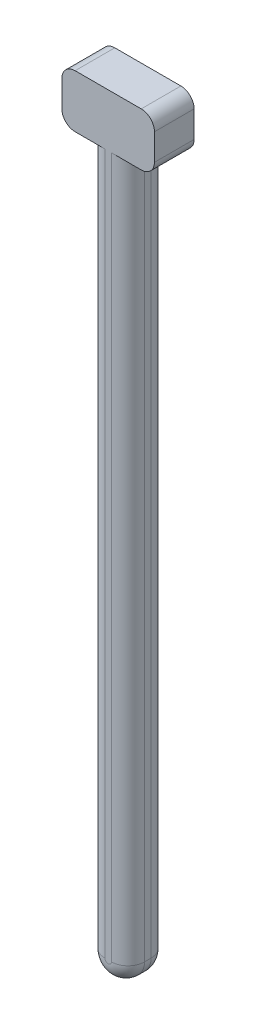
ISO-10303-21;
HEADER;
FILE_DESCRIPTION(('STEP AP214'),'2;1');
FILE_NAME('part.step','',(''),(''),'','','');
FILE_SCHEMA(('AUTOMOTIVE_DESIGN { 1 0 10303 214 1 1 1 1 }'));
ENDSEC;
DATA;
#1=APPLICATION_CONTEXT('core data for automotive mechanical design processes');
#2=APPLICATION_PROTOCOL_DEFINITION('international standard','automotive_design',2000,#1);
#3=PRODUCT_CONTEXT('',#1,'mechanical');
#4=PRODUCT('Part','Part','',(#3));
#5=PRODUCT_RELATED_PRODUCT_CATEGORY('part','',(#4));
#6=PRODUCT_DEFINITION_FORMATION('','',#4);
#7=PRODUCT_DEFINITION_CONTEXT('part definition',#1,'design');
#8=PRODUCT_DEFINITION('design','',#6,#7);
#9=PRODUCT_DEFINITION_SHAPE('','',#8);
#10=(LENGTH_UNIT() NAMED_UNIT(*) SI_UNIT(.MILLI.,.METRE.));
#11=(NAMED_UNIT(*) PLANE_ANGLE_UNIT() SI_UNIT($,.RADIAN.));
#12=(NAMED_UNIT(*) SI_UNIT($,.STERADIAN.) SOLID_ANGLE_UNIT());
#13=UNCERTAINTY_MEASURE_WITH_UNIT(LENGTH_MEASURE(1.E-05),#10,'distance_accuracy_value','');
#14=(GEOMETRIC_REPRESENTATION_CONTEXT(3) GLOBAL_UNCERTAINTY_ASSIGNED_CONTEXT((#13)) GLOBAL_UNIT_ASSIGNED_CONTEXT((#10,
#11,#12)) REPRESENTATION_CONTEXT('',''));
#15=CARTESIAN_POINT('',(0.,0.,0.));
#16=DIRECTION('',(0.,0.,1.));
#17=DIRECTION('',(1.,0.,0.));
#18=AXIS2_PLACEMENT_3D('',#15,#16,#17);
#19=CARTESIAN_POINT('',(0.,-2.,3.));
#20=DIRECTION('',(0.,1.,0.));
#21=DIRECTION('',(0.,0.,1.));
#22=AXIS2_PLACEMENT_3D('',#19,#20,#21);
#23=PLANE('',#22);
#24=DIRECTION('',(1.,0.,0.));
#25=VECTOR('',#24,1.);
#26=CARTESIAN_POINT('',(0.,-2.,3.));
#27=LINE('',#26,#25);
#28=CARTESIAN_POINT('',(-2.5,-2.,3.));
#29=VERTEX_POINT('',#28);
#30=CARTESIAN_POINT('',(-0.250000000000001,-2.,3.));
#31=VERTEX_POINT('',#30);
#32=EDGE_CURVE('E242',#29,#31,#27,.T.);
#33=ORIENTED_EDGE('',*,*,#32,.F.);
#34=DIRECTION('',(0.,0.,-1.));
#35=VECTOR('',#34,1.);
#36=CARTESIAN_POINT('',(-2.5,-2.,0.));
#37=LINE('',#36,#35);
#38=CARTESIAN_POINT('',(-2.5,-2.,0.));
#39=VERTEX_POINT('',#38);
#40=EDGE_CURVE('E194',#29,#39,#37,.T.);
#41=ORIENTED_EDGE('',*,*,#40,.T.);
#42=DIRECTION('',(1.,0.,0.));
#43=VECTOR('',#42,1.);
#44=CARTESIAN_POINT('',(0.,-2.,0.));
#45=LINE('',#44,#43);
#46=CARTESIAN_POINT('',(-0.250000000000001,-2.,0.));
#47=VERTEX_POINT('',#46);
#48=EDGE_CURVE('E260',#39,#47,#45,.T.);
#49=ORIENTED_EDGE('',*,*,#48,.T.);
#50=CARTESIAN_POINT('',(-0.250000000000001,-2.,1.25));
#51=DIRECTION('',(0.,1.,0.));
#52=DIRECTION('',(0.,0.,1.));
#53=AXIS2_PLACEMENT_3D('',#50,#51,#52);
#54=CIRCLE('',#53,1.25);
#55=CARTESIAN_POINT('',(-1.5,-2.,1.25));
#56=VERTEX_POINT('',#55);
#57=EDGE_CURVE('E288',#47,#56,#54,.T.);
#58=ORIENTED_EDGE('',*,*,#57,.T.);
#59=DIRECTION('',(0.,0.,-1.));
#60=VECTOR('',#59,1.);
#61=CARTESIAN_POINT('',(-1.5,-2.,3.));
#62=LINE('',#61,#60);
#63=CARTESIAN_POINT('',(-1.5,-2.,1.75));
#64=VERTEX_POINT('',#63);
#65=EDGE_CURVE('E172',#64,#56,#62,.T.);
#66=ORIENTED_EDGE('',*,*,#65,.F.);
#67=CARTESIAN_POINT('',(-0.250000000000001,-2.,1.75));
#68=DIRECTION('',(0.,1.,0.));
#69=DIRECTION('',(0.,0.,1.));
#70=AXIS2_PLACEMENT_3D('',#67,#68,#69);
#71=CIRCLE('',#70,1.25);
#72=EDGE_CURVE('E181',#64,#31,#71,.T.);
#73=ORIENTED_EDGE('',*,*,#72,.T.);
#74=EDGE_LOOP('',(#33,#41,#49,#58,#66,#73));
#75=FACE_BOUND('',#74,.T.);
#76=ADVANCED_FACE('F35',(#75),#23,.F.);
#77=CARTESIAN_POINT('',(-1.5,0.,3.));
#78=DIRECTION('',(1.,0.,0.));
#79=DIRECTION('',(0.,1.,0.));
#80=AXIS2_PLACEMENT_3D('',#77,#78,#79);
#81=PLANE('',#80);
#82=ORIENTED_EDGE('',*,*,#65,.T.);
#83=DIRECTION('',(0.,-1.,0.));
#84=VECTOR('',#83,1.);
#85=CARTESIAN_POINT('',(-1.5,0.,1.25));
#86=LINE('',#85,#84);
#87=CARTESIAN_POINT('',(-1.49999999999999,-55.,1.25));
#88=VERTEX_POINT('',#87);
#89=EDGE_CURVE('E171',#56,#88,#86,.T.);
#90=ORIENTED_EDGE('',*,*,#89,.T.);
#91=DIRECTION('',(0.,0.,-1.));
#92=VECTOR('',#91,1.);
#93=CARTESIAN_POINT('',(-1.49999999999999,-55.,3.));
#94=LINE('',#93,#92);
#95=CARTESIAN_POINT('',(-1.49999999999999,-55.,1.75));
#96=VERTEX_POINT('',#95);
#97=EDGE_CURVE('E153',#96,#88,#94,.T.);
#98=ORIENTED_EDGE('',*,*,#97,.F.);
#99=DIRECTION('',(0.,-1.,0.));
#100=VECTOR('',#99,1.);
#101=CARTESIAN_POINT('',(-1.5,-2.,1.75));
#102=LINE('',#101,#100);
#103=EDGE_CURVE('E168',#96,#64,#102,.F.);
#104=ORIENTED_EDGE('',*,*,#103,.T.);
#105=EDGE_LOOP('',(#82,#90,#98,#104));
#106=FACE_BOUND('',#105,.T.);
#107=ADVANCED_FACE('F167',(#106),#81,.F.);
#108=CARTESIAN_POINT('',(0.,-55.,3.));
#109=DIRECTION('',(0.,0.,-1.));
#110=DIRECTION('',(-1.,0.,0.));
#111=AXIS2_PLACEMENT_3D('',#108,#109,#110);
#112=CYLINDRICAL_SURFACE('',#111,1.5);
#113=ORIENTED_EDGE('',*,*,#97,.T.);
#114=CARTESIAN_POINT('',(0.,-55.,1.25));
#115=DIRECTION('',(0.,0.,1.));
#116=DIRECTION('',(1.,0.,0.));
#117=AXIS2_PLACEMENT_3D('',#114,#115,#116);
#118=CIRCLE('',#117,1.5);
#119=CARTESIAN_POINT('',(1.50000000000001,-55.,1.25));
#120=VERTEX_POINT('',#119);
#121=EDGE_CURVE('E160',#88,#120,#118,.T.);
#122=ORIENTED_EDGE('',*,*,#121,.T.);
#123=DIRECTION('',(0.,0.,-1.));
#124=VECTOR('',#123,1.);
#125=CARTESIAN_POINT('',(1.50000000000001,-55.,3.));
#126=LINE('',#125,#124);
#127=CARTESIAN_POINT('',(1.50000000000001,-55.,1.75));
#128=VERTEX_POINT('',#127);
#129=EDGE_CURVE('E155',#128,#120,#126,.T.);
#130=ORIENTED_EDGE('',*,*,#129,.F.);
#131=CARTESIAN_POINT('',(0.,-55.,1.75));
#132=DIRECTION('',(0.,0.,1.));
#133=DIRECTION('',(1.,0.,0.));
#134=AXIS2_PLACEMENT_3D('',#131,#132,#133);
#135=CIRCLE('',#134,1.5);
#136=EDGE_CURVE('E150',#128,#96,#135,.F.);
#137=ORIENTED_EDGE('',*,*,#136,.T.);
#138=EDGE_LOOP('',(#113,#122,#130,#137));
#139=FACE_BOUND('',#138,.T.);
#140=ADVANCED_FACE('F152',(#139),#112,.T.);
#141=CARTESIAN_POINT('',(1.5,0.,3.));
#142=DIRECTION('',(1.,0.,0.));
#143=DIRECTION('',(0.,1.,0.));
#144=AXIS2_PLACEMENT_3D('',#141,#142,#143);
#145=PLANE('',#144);
#146=ORIENTED_EDGE('',*,*,#129,.T.);
#147=DIRECTION('',(0.,-1.,0.));
#148=VECTOR('',#147,1.);
#149=CARTESIAN_POINT('',(1.5,-2.,1.25));
#150=LINE('',#149,#148);
#151=CARTESIAN_POINT('',(1.5,-2.,1.25));
#152=VERTEX_POINT('',#151);
#153=EDGE_CURVE('E286',#120,#152,#150,.F.);
#154=ORIENTED_EDGE('',*,*,#153,.T.);
#155=DIRECTION('',(0.,0.,-1.));
#156=VECTOR('',#155,1.);
#157=CARTESIAN_POINT('',(1.5,-2.,3.));
#158=LINE('',#157,#156);
#159=CARTESIAN_POINT('',(1.5,-2.,1.75));
#160=VERTEX_POINT('',#159);
#161=EDGE_CURVE('E266',#160,#152,#158,.T.);
#162=ORIENTED_EDGE('',*,*,#161,.F.);
#163=DIRECTION('',(0.,-1.,0.));
#164=VECTOR('',#163,1.);
#165=CARTESIAN_POINT('',(1.5,0.,1.75));
#166=LINE('',#165,#164);
#167=EDGE_CURVE('E284',#160,#128,#166,.T.);
#168=ORIENTED_EDGE('',*,*,#167,.T.);
#169=EDGE_LOOP('',(#146,#154,#162,#168));
#170=FACE_BOUND('',#169,.T.);
#171=ADVANCED_FACE('F327',(#170),#145,.T.);
#172=CARTESIAN_POINT('',(0.249999999999999,-2.,0.));
#173=VERTEX_POINT('',#172);
#174=CARTESIAN_POINT('',(2.5,-2.,0.));
#175=VERTEX_POINT('',#174);
#176=EDGE_CURVE('E232',#173,#175,#45,.T.);
#177=ORIENTED_EDGE('',*,*,#176,.T.);
#178=DIRECTION('',(0.,0.,-1.));
#179=VECTOR('',#178,1.);
#180=CARTESIAN_POINT('',(2.5,-2.,3.));
#181=LINE('',#180,#179);
#182=CARTESIAN_POINT('',(2.5,-2.,3.));
#183=VERTEX_POINT('',#182);
#184=EDGE_CURVE('E223',#175,#183,#181,.F.);
#185=ORIENTED_EDGE('',*,*,#184,.T.);
#186=CARTESIAN_POINT('',(0.249999999999999,-2.,3.));
#187=VERTEX_POINT('',#186);
#188=EDGE_CURVE('E229',#187,#183,#27,.T.);
#189=ORIENTED_EDGE('',*,*,#188,.F.);
#190=CARTESIAN_POINT('',(0.249999999999999,-2.,1.75));
#191=DIRECTION('',(0.,1.,0.));
#192=DIRECTION('',(0.,0.,1.));
#193=AXIS2_PLACEMENT_3D('',#190,#191,#192);
#194=CIRCLE('',#193,1.25);
#195=EDGE_CURVE('E198',#187,#160,#194,.T.);
#196=ORIENTED_EDGE('',*,*,#195,.T.);
#197=ORIENTED_EDGE('',*,*,#161,.T.);
#198=CARTESIAN_POINT('',(0.249999999999999,-2.,1.25));
#199=DIRECTION('',(0.,1.,0.));
#200=DIRECTION('',(0.,0.,1.));
#201=AXIS2_PLACEMENT_3D('',#198,#199,#200);
#202=CIRCLE('',#201,1.25);
#203=EDGE_CURVE('E291',#152,#173,#202,.T.);
#204=ORIENTED_EDGE('',*,*,#203,.T.);
#205=EDGE_LOOP('',(#177,#185,#189,#196,#197,#204));
#206=FACE_BOUND('',#205,.T.);
#207=ADVANCED_FACE('F228',(#206),#23,.F.);
#208=CARTESIAN_POINT('',(3.5,0.,3.));
#209=DIRECTION('',(-1.,0.,0.));
#210=DIRECTION('',(0.,0.,1.));
#211=AXIS2_PLACEMENT_3D('',#208,#209,#210);
#212=PLANE('',#211);
#213=DIRECTION('',(0.,1.,0.));
#214=VECTOR('',#213,1.);
#215=CARTESIAN_POINT('',(3.5,0.,3.));
#216=LINE('',#215,#214);
#217=CARTESIAN_POINT('',(3.5,-1.,3.));
#218=VERTEX_POINT('',#217);
#219=CARTESIAN_POINT('',(3.5,1.,3.));
#220=VERTEX_POINT('',#219);
#221=EDGE_CURVE('E241',#218,#220,#216,.T.);
#222=ORIENTED_EDGE('',*,*,#221,.F.);
#223=DIRECTION('',(0.,0.,-1.));
#224=VECTOR('',#223,1.);
#225=CARTESIAN_POINT('',(3.5,-1.,3.));
#226=LINE('',#225,#224);
#227=CARTESIAN_POINT('',(3.5,-1.,0.));
#228=VERTEX_POINT('',#227);
#229=EDGE_CURVE('E220',#218,#228,#226,.T.);
#230=ORIENTED_EDGE('',*,*,#229,.T.);
#231=DIRECTION('',(0.,1.,0.));
#232=VECTOR('',#231,1.);
#233=CARTESIAN_POINT('',(3.5,0.,0.));
#234=LINE('',#233,#232);
#235=CARTESIAN_POINT('',(3.5,1.,0.));
#236=VERTEX_POINT('',#235);
#237=EDGE_CURVE('E250',#228,#236,#234,.T.);
#238=ORIENTED_EDGE('',*,*,#237,.T.);
#239=DIRECTION('',(0.,0.,-1.));
#240=VECTOR('',#239,1.);
#241=CARTESIAN_POINT('',(3.5,1.,3.));
#242=LINE('',#241,#240);
#243=EDGE_CURVE('E218',#236,#220,#242,.F.);
#244=ORIENTED_EDGE('',*,*,#243,.T.);
#245=EDGE_LOOP('',(#222,#230,#238,#244));
#246=FACE_BOUND('',#245,.T.);
#247=ADVANCED_FACE('F249',(#246),#212,.F.);
#248=CARTESIAN_POINT('',(0.,2.,3.));
#249=DIRECTION('',(0.,1.,0.));
#250=DIRECTION('',(0.,0.,1.));
#251=AXIS2_PLACEMENT_3D('',#248,#249,#250);
#252=PLANE('',#251);
#253=DIRECTION('',(1.,0.,0.));
#254=VECTOR('',#253,1.);
#255=CARTESIAN_POINT('',(0.,2.,3.));
#256=LINE('',#255,#254);
#257=CARTESIAN_POINT('',(-2.5,2.,3.));
#258=VERTEX_POINT('',#257);
#259=CARTESIAN_POINT('',(2.5,2.,3.));
#260=VERTEX_POINT('',#259);
#261=EDGE_CURVE('E368',#258,#260,#256,.T.);
#262=ORIENTED_EDGE('',*,*,#261,.T.);
#263=DIRECTION('',(0.,0.,-1.));
#264=VECTOR('',#263,1.);
#265=CARTESIAN_POINT('',(2.5,2.,0.));
#266=LINE('',#265,#264);
#267=CARTESIAN_POINT('',(2.5,2.,0.));
#268=VERTEX_POINT('',#267);
#269=EDGE_CURVE('E11',#260,#268,#266,.T.);
#270=ORIENTED_EDGE('',*,*,#269,.T.);
#271=DIRECTION('',(1.,0.,0.));
#272=VECTOR('',#271,1.);
#273=CARTESIAN_POINT('',(0.,2.,0.));
#274=LINE('',#273,#272);
#275=CARTESIAN_POINT('',(-2.5,2.,0.));
#276=VERTEX_POINT('',#275);
#277=EDGE_CURVE('E256',#276,#268,#274,.T.);
#278=ORIENTED_EDGE('',*,*,#277,.F.);
#279=DIRECTION('',(0.,0.,-1.));
#280=VECTOR('',#279,1.);
#281=CARTESIAN_POINT('',(-2.5,2.,3.));
#282=LINE('',#281,#280);
#283=EDGE_CURVE('E43',#276,#258,#282,.F.);
#284=ORIENTED_EDGE('',*,*,#283,.T.);
#285=EDGE_LOOP('',(#262,#270,#278,#284));
#286=FACE_BOUND('',#285,.T.);
#287=ADVANCED_FACE('F332',(#286),#252,.T.);
#288=CARTESIAN_POINT('',(-3.5,0.,3.));
#289=DIRECTION('',(-1.,0.,0.));
#290=DIRECTION('',(0.,0.,1.));
#291=AXIS2_PLACEMENT_3D('',#288,#289,#290);
#292=PLANE('',#291);
#293=DIRECTION('',(0.,1.,0.));
#294=VECTOR('',#293,1.);
#295=CARTESIAN_POINT('',(-3.5,0.,0.));
#296=LINE('',#295,#294);
#297=CARTESIAN_POINT('',(-3.5,-1.,0.));
#298=VERTEX_POINT('',#297);
#299=CARTESIAN_POINT('',(-3.5,1.,0.));
#300=VERTEX_POINT('',#299);
#301=EDGE_CURVE('E258',#298,#300,#296,.T.);
#302=ORIENTED_EDGE('',*,*,#301,.F.);
#303=DIRECTION('',(0.,0.,-1.));
#304=VECTOR('',#303,1.);
#305=CARTESIAN_POINT('',(-3.5,-1.,3.));
#306=LINE('',#305,#304);
#307=CARTESIAN_POINT('',(-3.5,-1.,3.));
#308=VERTEX_POINT('',#307);
#309=EDGE_CURVE('E209',#298,#308,#306,.F.);
#310=ORIENTED_EDGE('',*,*,#309,.T.);
#311=DIRECTION('',(0.,1.,0.));
#312=VECTOR('',#311,1.);
#313=CARTESIAN_POINT('',(-3.5,0.,3.));
#314=LINE('',#313,#312);
#315=CARTESIAN_POINT('',(-3.5,1.,3.));
#316=VERTEX_POINT('',#315);
#317=EDGE_CURVE('E269',#308,#316,#314,.T.);
#318=ORIENTED_EDGE('',*,*,#317,.T.);
#319=DIRECTION('',(0.,0.,-1.));
#320=VECTOR('',#319,1.);
#321=CARTESIAN_POINT('',(-3.5,1.,3.));
#322=LINE('',#321,#320);
#323=EDGE_CURVE('E206',#316,#300,#322,.T.);
#324=ORIENTED_EDGE('',*,*,#323,.T.);
#325=EDGE_LOOP('',(#302,#310,#318,#324));
#326=FACE_BOUND('',#325,.T.);
#327=ADVANCED_FACE('F374',(#326),#292,.T.);
#328=CARTESIAN_POINT('',(0.,0.,3.));
#329=DIRECTION('',(0.,0.,1.));
#330=DIRECTION('',(1.,0.,0.));
#331=AXIS2_PLACEMENT_3D('',#328,#329,#330);
#332=PLANE('',#331);
#333=ORIENTED_EDGE('',*,*,#317,.F.);
#334=CARTESIAN_POINT('',(-2.5,-1.,3.));
#335=DIRECTION('',(0.,0.,1.));
#336=DIRECTION('',(1.,0.,0.));
#337=AXIS2_PLACEMENT_3D('',#334,#335,#336);
#338=CIRCLE('',#337,1.);
#339=EDGE_CURVE('E216',#308,#29,#338,.T.);
#340=ORIENTED_EDGE('',*,*,#339,.T.);
#341=ORIENTED_EDGE('',*,*,#32,.T.);
#342=DIRECTION('',(0.,-1.,0.));
#343=VECTOR('',#342,1.);
#344=CARTESIAN_POINT('',(-0.249999999999995,-55.,3.));
#345=LINE('',#344,#343);
#346=CARTESIAN_POINT('',(-0.249999999999995,-55.,3.));
#347=VERTEX_POINT('',#346);
#348=EDGE_CURVE('E282',#31,#347,#345,.T.);
#349=ORIENTED_EDGE('',*,*,#348,.T.);
#350=CARTESIAN_POINT('',(0.,-55.,3.));
#351=DIRECTION('',(0.,0.,1.));
#352=DIRECTION('',(1.,0.,0.));
#353=AXIS2_PLACEMENT_3D('',#350,#351,#352);
#354=CIRCLE('',#353,0.25);
#355=CARTESIAN_POINT('',(0.250000000000005,-55.,3.));
#356=VERTEX_POINT('',#355);
#357=EDGE_CURVE('E184',#347,#356,#354,.T.);
#358=ORIENTED_EDGE('',*,*,#357,.T.);
#359=DIRECTION('',(0.,-1.,0.));
#360=VECTOR('',#359,1.);
#361=CARTESIAN_POINT('',(0.249999999999999,0.,3.));
#362=LINE('',#361,#360);
#363=EDGE_CURVE('E239',#356,#187,#362,.F.);
#364=ORIENTED_EDGE('',*,*,#363,.T.);
#365=ORIENTED_EDGE('',*,*,#188,.T.);
#366=CARTESIAN_POINT('',(2.5,-1.,3.));
#367=DIRECTION('',(0.,0.,1.));
#368=DIRECTION('',(1.,0.,0.));
#369=AXIS2_PLACEMENT_3D('',#366,#367,#368);
#370=CIRCLE('',#369,1.);
#371=EDGE_CURVE('E214',#183,#218,#370,.T.);
#372=ORIENTED_EDGE('',*,*,#371,.T.);
#373=ORIENTED_EDGE('',*,*,#221,.T.);
#374=CARTESIAN_POINT('',(2.5,1.,3.));
#375=DIRECTION('',(0.,0.,1.));
#376=DIRECTION('',(1.,0.,0.));
#377=AXIS2_PLACEMENT_3D('',#374,#375,#376);
#378=CIRCLE('',#377,1.);
#379=EDGE_CURVE('E50',#220,#260,#378,.T.);
#380=ORIENTED_EDGE('',*,*,#379,.T.);
#381=ORIENTED_EDGE('',*,*,#261,.F.);
#382=CARTESIAN_POINT('',(-2.5,1.,3.));
#383=DIRECTION('',(0.,0.,1.));
#384=DIRECTION('',(1.,0.,0.));
#385=AXIS2_PLACEMENT_3D('',#382,#383,#384);
#386=CIRCLE('',#385,1.);
#387=EDGE_CURVE('E211',#258,#316,#386,.T.);
#388=ORIENTED_EDGE('',*,*,#387,.T.);
#389=EDGE_LOOP('',(#333,#340,#341,#349,#358,#364,#365,#372,#373,#380,#381,#388));
#390=FACE_BOUND('',#389,.T.);
#391=ADVANCED_FACE('F236',(#390),#332,.T.);
#392=CARTESIAN_POINT('',(0.,0.,0.));
#393=DIRECTION('',(0.,0.,1.));
#394=DIRECTION('',(1.,0.,0.));
#395=AXIS2_PLACEMENT_3D('',#392,#393,#394);
#396=PLANE('',#395);
#397=ORIENTED_EDGE('',*,*,#48,.F.);
#398=CARTESIAN_POINT('',(-2.5,-1.,0.));
#399=DIRECTION('',(0.,0.,1.));
#400=DIRECTION('',(1.,0.,0.));
#401=AXIS2_PLACEMENT_3D('',#398,#399,#400);
#402=CIRCLE('',#401,1.);
#403=EDGE_CURVE('E204',#39,#298,#402,.F.);
#404=ORIENTED_EDGE('',*,*,#403,.T.);
#405=ORIENTED_EDGE('',*,*,#301,.T.);
#406=CARTESIAN_POINT('',(-2.5,1.,0.));
#407=DIRECTION('',(0.,0.,1.));
#408=DIRECTION('',(1.,0.,0.));
#409=AXIS2_PLACEMENT_3D('',#406,#407,#408);
#410=CIRCLE('',#409,1.);
#411=EDGE_CURVE('E197',#300,#276,#410,.F.);
#412=ORIENTED_EDGE('',*,*,#411,.T.);
#413=ORIENTED_EDGE('',*,*,#277,.T.);
#414=CARTESIAN_POINT('',(2.5,1.,0.));
#415=DIRECTION('',(0.,0.,1.));
#416=DIRECTION('',(1.,0.,0.));
#417=AXIS2_PLACEMENT_3D('',#414,#415,#416);
#418=CIRCLE('',#417,1.);
#419=EDGE_CURVE('E200',#268,#236,#418,.F.);
#420=ORIENTED_EDGE('',*,*,#419,.T.);
#421=ORIENTED_EDGE('',*,*,#237,.F.);
#422=CARTESIAN_POINT('',(2.5,-1.,0.));
#423=DIRECTION('',(0.,0.,1.));
#424=DIRECTION('',(1.,0.,0.));
#425=AXIS2_PLACEMENT_3D('',#422,#423,#424);
#426=CIRCLE('',#425,1.);
#427=EDGE_CURVE('E202',#228,#175,#426,.F.);
#428=ORIENTED_EDGE('',*,*,#427,.T.);
#429=ORIENTED_EDGE('',*,*,#176,.F.);
#430=DIRECTION('',(0.,-1.,0.));
#431=VECTOR('',#430,1.);
#432=CARTESIAN_POINT('',(0.250000000000005,-55.,0.));
#433=LINE('',#432,#431);
#434=CARTESIAN_POINT('',(0.250000000000005,-55.,0.));
#435=VERTEX_POINT('',#434);
#436=EDGE_CURVE('E273',#173,#435,#433,.T.);
#437=ORIENTED_EDGE('',*,*,#436,.T.);
#438=CARTESIAN_POINT('',(0.,-55.,0.));
#439=DIRECTION('',(0.,0.,1.));
#440=DIRECTION('',(1.,0.,0.));
#441=AXIS2_PLACEMENT_3D('',#438,#439,#440);
#442=CIRCLE('',#441,0.25);
#443=CARTESIAN_POINT('',(-0.249999999999995,-55.,0.));
#444=VERTEX_POINT('',#443);
#445=EDGE_CURVE('E275',#435,#444,#442,.F.);
#446=ORIENTED_EDGE('',*,*,#445,.T.);
#447=DIRECTION('',(0.,-1.,0.));
#448=VECTOR('',#447,1.);
#449=CARTESIAN_POINT('',(-0.250000000000001,0.,0.));
#450=LINE('',#449,#448);
#451=EDGE_CURVE('E161',#444,#47,#450,.F.);
#452=ORIENTED_EDGE('',*,*,#451,.T.);
#453=EDGE_LOOP('',(#397,#404,#405,#412,#413,#420,#421,#428,#429,#437,#446,#452));
#454=FACE_BOUND('',#453,.T.);
#455=ADVANCED_FACE('F254',(#454),#396,.F.);
#456=CARTESIAN_POINT('',(0.249999999999999,0.,1.25));
#457=DIRECTION('',(0.,1.,0.));
#458=DIRECTION('',(-1.,0.,0.));
#459=AXIS2_PLACEMENT_3D('',#456,#457,#458);
#460=CYLINDRICAL_SURFACE('',#459,1.25);
#461=ORIENTED_EDGE('',*,*,#203,.F.);
#462=ORIENTED_EDGE('',*,*,#153,.F.);
#463=CARTESIAN_POINT('',(0.250000000000005,-55.,1.25));
#464=DIRECTION('',(0.,-1.,0.));
#465=DIRECTION('',(0.,0.,-1.));
#466=AXIS2_PLACEMENT_3D('',#463,#464,#465);
#467=CIRCLE('',#466,1.25);
#468=EDGE_CURVE('E191',#435,#120,#467,.T.);
#469=ORIENTED_EDGE('',*,*,#468,.F.);
#470=ORIENTED_EDGE('',*,*,#436,.F.);
#471=EDGE_LOOP('',(#461,#462,#469,#470));
#472=FACE_BOUND('',#471,.T.);
#473=ADVANCED_FACE('F316',(#472),#460,.T.);
#474=CARTESIAN_POINT('',(0.,-55.,1.25));
#475=DIRECTION('',(0.,0.,1.));
#476=DIRECTION('',(1.,0.,0.));
#477=AXIS2_PLACEMENT_3D('',#474,#475,#476);
#478=DEGENERATE_TOROIDAL_SURFACE('',#477,0.25,1.25,.T.);
#479=ORIENTED_EDGE('',*,*,#468,.T.);
#480=ORIENTED_EDGE('',*,*,#121,.F.);
#481=CARTESIAN_POINT('',(-0.249999999999995,-55.,1.25));
#482=DIRECTION('',(0.,1.,0.));
#483=DIRECTION('',(0.,0.,1.));
#484=AXIS2_PLACEMENT_3D('',#481,#482,#483);
#485=CIRCLE('',#484,1.25);
#486=EDGE_CURVE('E188',#444,#88,#485,.T.);
#487=ORIENTED_EDGE('',*,*,#486,.F.);
#488=ORIENTED_EDGE('',*,*,#445,.F.);
#489=EDGE_LOOP('',(#479,#480,#487,#488));
#490=FACE_BOUND('',#489,.T.);
#491=ADVANCED_FACE('F308',(#490),#478,.T.);
#492=CARTESIAN_POINT('',(-0.250000000000001,0.,1.25));
#493=DIRECTION('',(0.,-1.,0.));
#494=DIRECTION('',(1.,0.,0.));
#495=AXIS2_PLACEMENT_3D('',#492,#493,#494);
#496=CYLINDRICAL_SURFACE('',#495,1.25);
#497=ORIENTED_EDGE('',*,*,#57,.F.);
#498=ORIENTED_EDGE('',*,*,#451,.F.);
#499=ORIENTED_EDGE('',*,*,#486,.T.);
#500=ORIENTED_EDGE('',*,*,#89,.F.);
#501=EDGE_LOOP('',(#497,#498,#499,#500));
#502=FACE_BOUND('',#501,.T.);
#503=ADVANCED_FACE('F305',(#502),#496,.T.);
#504=CARTESIAN_POINT('',(0.249999999999999,0.,1.75));
#505=DIRECTION('',(0.,-1.,0.));
#506=DIRECTION('',(1.,0.,0.));
#507=AXIS2_PLACEMENT_3D('',#504,#505,#506);
#508=CYLINDRICAL_SURFACE('',#507,1.25);
#509=ORIENTED_EDGE('',*,*,#195,.F.);
#510=ORIENTED_EDGE('',*,*,#363,.F.);
#511=CARTESIAN_POINT('',(0.250000000000005,-55.,1.75));
#512=DIRECTION('',(0.,-1.,0.));
#513=DIRECTION('',(0.,0.,-1.));
#514=AXIS2_PLACEMENT_3D('',#511,#512,#513);
#515=CIRCLE('',#514,1.25);
#516=EDGE_CURVE('E186',#128,#356,#515,.T.);
#517=ORIENTED_EDGE('',*,*,#516,.F.);
#518=ORIENTED_EDGE('',*,*,#167,.F.);
#519=EDGE_LOOP('',(#509,#510,#517,#518));
#520=FACE_BOUND('',#519,.T.);
#521=ADVANCED_FACE('F307',(#520),#508,.T.);
#522=CARTESIAN_POINT('',(0.,-55.,1.75));
#523=DIRECTION('',(0.,0.,1.));
#524=DIRECTION('',(1.,0.,0.));
#525=AXIS2_PLACEMENT_3D('',#522,#523,#524);
#526=DEGENERATE_TOROIDAL_SURFACE('',#525,0.25,1.25,.T.);
#527=ORIENTED_EDGE('',*,*,#516,.T.);
#528=ORIENTED_EDGE('',*,*,#357,.F.);
#529=CARTESIAN_POINT('',(-0.249999999999995,-55.,1.75));
#530=DIRECTION('',(0.,1.,0.));
#531=DIRECTION('',(0.,0.,1.));
#532=AXIS2_PLACEMENT_3D('',#529,#530,#531);
#533=CIRCLE('',#532,1.25);
#534=EDGE_CURVE('E178',#96,#347,#533,.T.);
#535=ORIENTED_EDGE('',*,*,#534,.F.);
#536=ORIENTED_EDGE('',*,*,#136,.F.);
#537=EDGE_LOOP('',(#527,#528,#535,#536));
#538=FACE_BOUND('',#537,.T.);
#539=ADVANCED_FACE('F183',(#538),#526,.T.);
#540=CARTESIAN_POINT('',(-0.250000000000001,0.,1.75));
#541=DIRECTION('',(0.,1.,0.));
#542=DIRECTION('',(-1.,0.,0.));
#543=AXIS2_PLACEMENT_3D('',#540,#541,#542);
#544=CYLINDRICAL_SURFACE('',#543,1.25);
#545=ORIENTED_EDGE('',*,*,#72,.F.);
#546=ORIENTED_EDGE('',*,*,#103,.F.);
#547=ORIENTED_EDGE('',*,*,#534,.T.);
#548=ORIENTED_EDGE('',*,*,#348,.F.);
#549=EDGE_LOOP('',(#545,#546,#547,#548));
#550=FACE_BOUND('',#549,.T.);
#551=ADVANCED_FACE('F176',(#550),#544,.T.);
#552=CARTESIAN_POINT('',(-2.5,-1.,3.));
#553=DIRECTION('',(0.,0.,1.));
#554=DIRECTION('',(1.,0.,0.));
#555=AXIS2_PLACEMENT_3D('',#552,#553,#554);
#556=CYLINDRICAL_SURFACE('',#555,1.);
#557=ORIENTED_EDGE('',*,*,#339,.F.);
#558=ORIENTED_EDGE('',*,*,#309,.F.);
#559=ORIENTED_EDGE('',*,*,#403,.F.);
#560=ORIENTED_EDGE('',*,*,#40,.F.);
#561=EDGE_LOOP('',(#557,#558,#559,#560));
#562=FACE_BOUND('',#561,.T.);
#563=ADVANCED_FACE('F353',(#562),#556,.T.);
#564=CARTESIAN_POINT('',(2.5,-1.,3.));
#565=DIRECTION('',(0.,0.,-1.));
#566=DIRECTION('',(-1.,0.,0.));
#567=AXIS2_PLACEMENT_3D('',#564,#565,#566);
#568=CYLINDRICAL_SURFACE('',#567,1.);
#569=ORIENTED_EDGE('',*,*,#371,.F.);
#570=ORIENTED_EDGE('',*,*,#184,.F.);
#571=ORIENTED_EDGE('',*,*,#427,.F.);
#572=ORIENTED_EDGE('',*,*,#229,.F.);
#573=EDGE_LOOP('',(#569,#570,#571,#572));
#574=FACE_BOUND('',#573,.T.);
#575=ADVANCED_FACE('F245',(#574),#568,.T.);
#576=CARTESIAN_POINT('',(2.5,1.,3.));
#577=DIRECTION('',(0.,0.,1.));
#578=DIRECTION('',(1.,0.,0.));
#579=AXIS2_PLACEMENT_3D('',#576,#577,#578);
#580=CYLINDRICAL_SURFACE('',#579,1.);
#581=ORIENTED_EDGE('',*,*,#379,.F.);
#582=ORIENTED_EDGE('',*,*,#243,.F.);
#583=ORIENTED_EDGE('',*,*,#419,.F.);
#584=ORIENTED_EDGE('',*,*,#269,.F.);
#585=EDGE_LOOP('',(#581,#582,#583,#584));
#586=FACE_BOUND('',#585,.T.);
#587=ADVANCED_FACE('F360',(#586),#580,.T.);
#588=CARTESIAN_POINT('',(-2.5,1.,3.));
#589=DIRECTION('',(0.,0.,-1.));
#590=DIRECTION('',(-1.,0.,0.));
#591=AXIS2_PLACEMENT_3D('',#588,#589,#590);
#592=CYLINDRICAL_SURFACE('',#591,1.);
#593=ORIENTED_EDGE('',*,*,#387,.F.);
#594=ORIENTED_EDGE('',*,*,#283,.F.);
#595=ORIENTED_EDGE('',*,*,#411,.F.);
#596=ORIENTED_EDGE('',*,*,#323,.F.);
#597=EDGE_LOOP('',(#593,#594,#595,#596));
#598=FACE_BOUND('',#597,.T.);
#599=ADVANCED_FACE('F37',(#598),#592,.T.);
#600=CLOSED_SHELL('',(#76,#107,#140,#171,#207,#247,#287,#327,#391,#455,#473,#491,#503,#521,#539,
#551,#563,#575,#587,#599));
#601=MANIFOLD_SOLID_BREP('B2',#600);
#602=ADVANCED_BREP_SHAPE_REPRESENTATION('',(#18,#601),#14);
#603=SHAPE_DEFINITION_REPRESENTATION(#9,#602);
ENDSEC;
END-ISO-10303-21;
